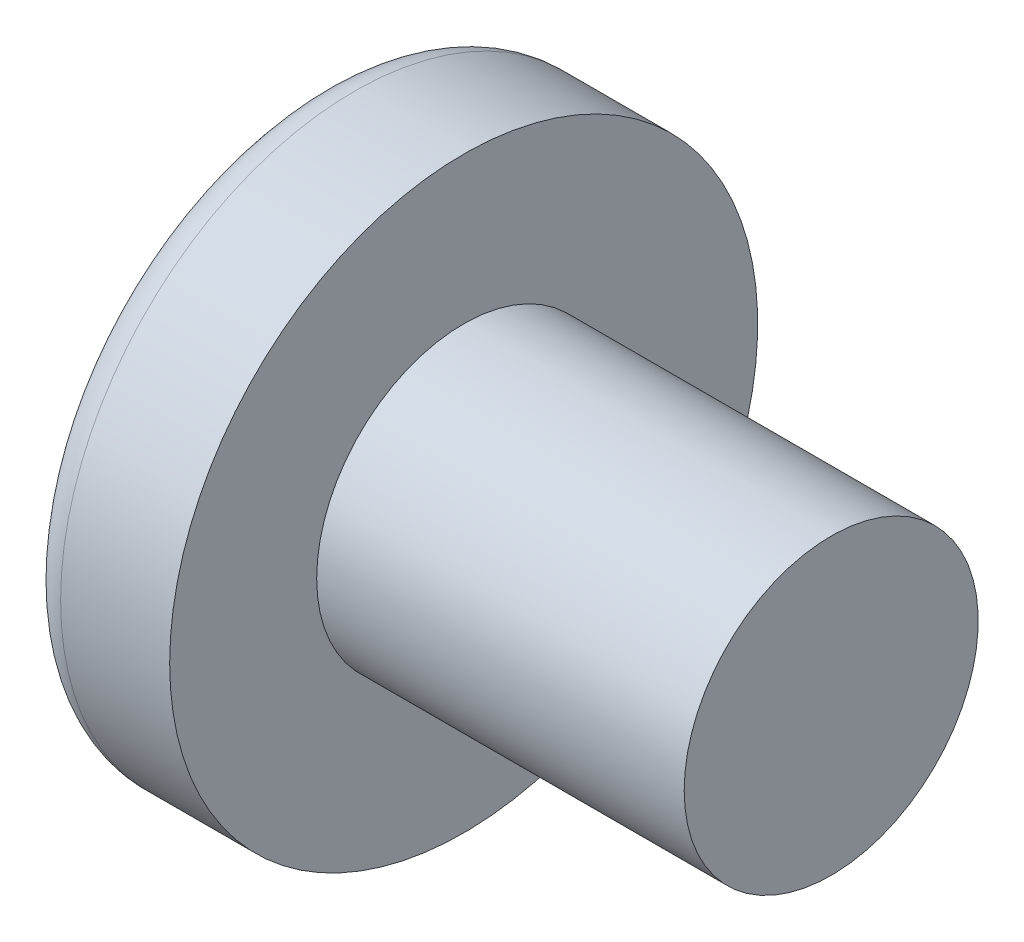
ISO-10303-21;
HEADER;
FILE_DESCRIPTION(('STEP AP214'),'2;1');
FILE_NAME('part.step','',(''),(''),'','','');
FILE_SCHEMA(('AUTOMOTIVE_DESIGN { 1 0 10303 214 1 1 1 1 }'));
ENDSEC;
DATA;
#1=APPLICATION_CONTEXT('core data for automotive mechanical design processes');
#2=APPLICATION_PROTOCOL_DEFINITION('international standard','automotive_design',2000,#1);
#3=PRODUCT_CONTEXT('',#1,'mechanical');
#4=PRODUCT('Part','Part','',(#3));
#5=PRODUCT_RELATED_PRODUCT_CATEGORY('part','',(#4));
#6=PRODUCT_DEFINITION_FORMATION('','',#4);
#7=PRODUCT_DEFINITION_CONTEXT('part definition',#1,'design');
#8=PRODUCT_DEFINITION('design','',#6,#7);
#9=PRODUCT_DEFINITION_SHAPE('','',#8);
#10=(LENGTH_UNIT() NAMED_UNIT(*) SI_UNIT(.MILLI.,.METRE.));
#11=(NAMED_UNIT(*) PLANE_ANGLE_UNIT() SI_UNIT($,.RADIAN.));
#12=(NAMED_UNIT(*) SI_UNIT($,.STERADIAN.) SOLID_ANGLE_UNIT());
#13=UNCERTAINTY_MEASURE_WITH_UNIT(LENGTH_MEASURE(1.E-05),#10,'distance_accuracy_value','');
#14=(GEOMETRIC_REPRESENTATION_CONTEXT(3) GLOBAL_UNCERTAINTY_ASSIGNED_CONTEXT((#13)) GLOBAL_UNIT_ASSIGNED_CONTEXT((#10,
#11,#12)) REPRESENTATION_CONTEXT('',''));
#15=CARTESIAN_POINT('',(0.,0.,0.));
#16=DIRECTION('',(0.,0.,1.));
#17=DIRECTION('',(1.,0.,0.));
#18=AXIS2_PLACEMENT_3D('',#15,#16,#17);
#19=CARTESIAN_POINT('',(6.5,0.,0.));
#20=DIRECTION('',(-1.,0.,0.));
#21=DIRECTION('',(0.,1.,0.));
#22=AXIS2_PLACEMENT_3D('',#19,#20,#21);
#23=SPHERICAL_SURFACE('',#22,6.5);
#24=CARTESIAN_POINT('',(1.22696010591455,0.,0.));
#25=DIRECTION('',(-1.,0.,0.));
#26=DIRECTION('',(0.,0.,1.));
#27=AXIS2_PLACEMENT_3D('',#24,#25,#26);
#28=CIRCLE('',#27,3.80066445182724);
#29=CARTESIAN_POINT('',(1.22696010591455,0.,3.80066445182724));
#30=VERTEX_POINT('',#29);
#31=EDGE_CURVE('E153',#30,#30,#28,.T.);
#32=ORIENTED_EDGE('',*,*,#31,.T.);
#33=EDGE_LOOP('',(#32));
#34=FACE_BOUND('',#33,.T.);
#35=CARTESIAN_POINT('',(6.48571960757402,-0.15048155459631,0.));
#36=DIRECTION('',(-0.0944735162161081,-0.995527375180494,0.));
#37=DIRECTION('',(0.995527375180494,-0.0944735162161081,0.));
#38=AXIS2_PLACEMENT_3D('',#35,#36,#37);
#39=CIRCLE('',#38,6.49824217555167);
#40=CARTESIAN_POINT('',(0.314004666074212,0.4352015980154,1.94783502836694));
#41=VERTEX_POINT('',#40);
#42=CARTESIAN_POINT('',(0.0329034112486444,0.461877533422321,0.461877533422323));
#43=VERTEX_POINT('',#42);
#44=EDGE_CURVE('E184',#41,#43,#39,.T.);
#45=ORIENTED_EDGE('',*,*,#44,.F.);
#46=CARTESIAN_POINT('',(5.02565375064329,0.,-1.83590765485334));
#47=DIRECTION('',(0.626149356629992,0.,0.779703137861998));
#48=DIRECTION('',(0.779703137861998,0.,-0.626149356629992));
#49=AXIS2_PLACEMENT_3D('',#46,#47,#48);
#50=CIRCLE('',#49,6.05852673674539);
#51=CARTESIAN_POINT('',(0.314004666074212,-0.435201598015413,1.94783502836693));
#52=VERTEX_POINT('',#51);
#53=EDGE_CURVE('E149',#41,#52,#50,.T.);
#54=ORIENTED_EDGE('',*,*,#53,.T.);
#55=CARTESIAN_POINT('',(6.48571960757402,0.15048155459631,0.));
#56=DIRECTION('',(-0.0944735162161081,0.995527375180494,0.));
#57=DIRECTION('',(-0.995527375180494,-0.0944735162161081,0.));
#58=AXIS2_PLACEMENT_3D('',#55,#56,#57);
#59=CIRCLE('',#58,6.49824217555167);
#60=CARTESIAN_POINT('',(0.0329034112486444,-0.461877533422324,0.461877533422322));
#61=VERTEX_POINT('',#60);
#62=EDGE_CURVE('E105',#61,#52,#59,.T.);
#63=ORIENTED_EDGE('',*,*,#62,.F.);
#64=CARTESIAN_POINT('',(6.48571960757402,0.,-0.15048155459631));
#65=DIRECTION('',(-0.0944735162161081,0.,-0.995527375180494));
#66=DIRECTION('',(-0.995527375180494,0.,0.0944735162161081));
#67=AXIS2_PLACEMENT_3D('',#64,#65,#66);
#68=CIRCLE('',#67,6.49824217555167);
#69=CARTESIAN_POINT('',(0.314004666074212,-1.94783502836693,0.435201598015406));
#70=VERTEX_POINT('',#69);
#71=EDGE_CURVE('E130',#70,#61,#68,.T.);
#72=ORIENTED_EDGE('',*,*,#71,.F.);
#73=CARTESIAN_POINT('',(5.02565375064329,1.83590765485334,0.));
#74=DIRECTION('',(0.626149356629992,-0.779703137861998,0.));
#75=DIRECTION('',(0.779703137861998,0.626149356629992,0.));
#76=AXIS2_PLACEMENT_3D('',#73,#74,#75);
#77=CIRCLE('',#76,6.05852673674539);
#78=CARTESIAN_POINT('',(0.314004666074212,-1.94783502836693,-0.435201598015406));
#79=VERTEX_POINT('',#78);
#80=EDGE_CURVE('E138',#70,#79,#77,.T.);
#81=ORIENTED_EDGE('',*,*,#80,.T.);
#82=CARTESIAN_POINT('',(6.48571960757402,0.,0.15048155459631));
#83=DIRECTION('',(-0.0944735162161081,0.,0.995527375180494));
#84=DIRECTION('',(0.995527375180494,0.,0.0944735162161081));
#85=AXIS2_PLACEMENT_3D('',#82,#83,#84);
#86=CIRCLE('',#85,6.49824217555167);
#87=CARTESIAN_POINT('',(0.0329034112486444,-0.461877533422321,-0.461877533422323));
#88=VERTEX_POINT('',#87);
#89=EDGE_CURVE('E48',#88,#79,#86,.T.);
#90=ORIENTED_EDGE('',*,*,#89,.F.);
#91=CARTESIAN_POINT('',(0.314004666074212,-0.435201598015399,-1.94783502836693));
#92=VERTEX_POINT('',#91);
#93=EDGE_CURVE('E191',#92,#88,#59,.T.);
#94=ORIENTED_EDGE('',*,*,#93,.F.);
#95=CARTESIAN_POINT('',(5.02565375064329,0.,1.83590765485334));
#96=DIRECTION('',(0.626149356629992,0.,-0.779703137861998));
#97=DIRECTION('',(-0.779703137861998,0.,-0.626149356629992));
#98=AXIS2_PLACEMENT_3D('',#95,#96,#97);
#99=CIRCLE('',#98,6.05852673674539);
#100=CARTESIAN_POINT('',(0.314004666074212,0.435201598015413,-1.94783502836693));
#101=VERTEX_POINT('',#100);
#102=EDGE_CURVE('E131',#92,#101,#99,.T.);
#103=ORIENTED_EDGE('',*,*,#102,.T.);
#104=CARTESIAN_POINT('',(0.0329034112486444,0.461877533422324,-0.461877533422323));
#105=VERTEX_POINT('',#104);
#106=EDGE_CURVE('E179',#105,#101,#39,.T.);
#107=ORIENTED_EDGE('',*,*,#106,.F.);
#108=CARTESIAN_POINT('',(0.314004666074212,1.94783502836693,-0.435201598015406));
#109=VERTEX_POINT('',#108);
#110=EDGE_CURVE('E41',#109,#105,#86,.T.);
#111=ORIENTED_EDGE('',*,*,#110,.F.);
#112=CARTESIAN_POINT('',(5.02565375064329,-1.83590765485334,0.));
#113=DIRECTION('',(0.626149356629992,0.779703137861998,0.));
#114=DIRECTION('',(-0.779703137861998,0.626149356629992,0.));
#115=AXIS2_PLACEMENT_3D('',#112,#113,#114);
#116=CIRCLE('',#115,6.05852673674539);
#117=CARTESIAN_POINT('',(0.314004666074212,1.94783502836693,0.435201598015407));
#118=VERTEX_POINT('',#117);
#119=EDGE_CURVE('E11',#109,#118,#116,.T.);
#120=ORIENTED_EDGE('',*,*,#119,.T.);
#121=EDGE_CURVE('E167',#43,#118,#68,.T.);
#122=ORIENTED_EDGE('',*,*,#121,.F.);
#123=EDGE_LOOP('',(#45,#54,#63,#72,#81,#90,#94,#103,#107,#111,#120,#122));
#124=FACE_BOUND('',#123,.T.);
#125=ADVANCED_FACE('F33',(#34,#124),#23,.T.);
#126=CARTESIAN_POINT('',(2.73951715374841,0.,-0.20502541296061));
#127=DIRECTION('',(-0.0944735162161081,0.,0.995527375180494));
#128=DIRECTION('',(0.995527375180494,0.,0.0944735162161081));
#129=AXIS2_PLACEMENT_3D('',#126,#127,#128);
#130=PLANE('',#129);
#131=ORIENTED_EDGE('',*,*,#110,.T.);
#132=DIRECTION('',(0.991114231601325,-0.0940547178968607,0.0940547178968604));
#133=VECTOR('',#132,1.);
#134=CARTESIAN_POINT('',(2.75862941145706,0.203211698708667,-0.203211698708667));
#135=LINE('',#134,#133);
#136=CARTESIAN_POINT('',(2.45,0.232500000000001,-0.232499999999999));
#137=VERTEX_POINT('',#136);
#138=EDGE_CURVE('E173',#105,#137,#135,.T.);
#139=ORIENTED_EDGE('',*,*,#138,.T.);
#140=DIRECTION('',(0.777577482844895,-0.624442325509115,0.0737905162291584));
#141=VECTOR('',#140,1.);
#142=CARTESIAN_POINT('',(0.,2.2,-0.465));
#143=LINE('',#142,#141);
#144=EDGE_CURVE('E154',#109,#137,#143,.T.);
#145=ORIENTED_EDGE('',*,*,#144,.F.);
#146=EDGE_LOOP('',(#131,#139,#145));
#147=FACE_BOUND('',#146,.T.);
#148=ADVANCED_FACE('F172',(#147),#130,.T.);
#149=DIRECTION('',(0.777577482844895,0.624442325509115,0.0737905162291584));
#150=VECTOR('',#149,1.);
#151=CARTESIAN_POINT('',(0.,-2.2,-0.465));
#152=LINE('',#151,#150);
#153=CARTESIAN_POINT('',(2.45,-0.2325,-0.2325));
#154=VERTEX_POINT('',#153);
#155=EDGE_CURVE('E139',#79,#154,#152,.T.);
#156=ORIENTED_EDGE('',*,*,#155,.T.);
#157=DIRECTION('',(-0.991114231601325,-0.09405471789686,-0.0940547178968604));
#158=VECTOR('',#157,1.);
#159=CARTESIAN_POINT('',(2.75862941145706,-0.203211698708666,-0.203211698708667));
#160=LINE('',#159,#158);
#161=EDGE_CURVE('E194',#154,#88,#160,.T.);
#162=ORIENTED_EDGE('',*,*,#161,.T.);
#163=ORIENTED_EDGE('',*,*,#89,.T.);
#164=EDGE_LOOP('',(#156,#162,#163));
#165=FACE_BOUND('',#164,.T.);
#166=ADVANCED_FACE('F209',(#165),#130,.T.);
#167=CARTESIAN_POINT('',(2.73951715374841,0.,0.20502541296061));
#168=DIRECTION('',(-0.0944735162161081,0.,-0.995527375180494));
#169=DIRECTION('',(-0.995527375180494,0.,0.0944735162161081));
#170=AXIS2_PLACEMENT_3D('',#167,#168,#169);
#171=PLANE('',#170);
#172=DIRECTION('',(0.777577482844895,-0.624442325509115,-0.0737905162291584));
#173=VECTOR('',#172,1.);
#174=CARTESIAN_POINT('',(0.,2.2,0.465));
#175=LINE('',#174,#173);
#176=CARTESIAN_POINT('',(2.45,0.2325,0.2325));
#177=VERTEX_POINT('',#176);
#178=EDGE_CURVE('E210',#118,#177,#175,.T.);
#179=ORIENTED_EDGE('',*,*,#178,.T.);
#180=DIRECTION('',(-0.991114231601325,0.0940547178968601,0.0940547178968603));
#181=VECTOR('',#180,1.);
#182=CARTESIAN_POINT('',(2.75862941145706,0.203211698708666,0.203211698708667));
#183=LINE('',#182,#181);
#184=EDGE_CURVE('E188',#177,#43,#183,.T.);
#185=ORIENTED_EDGE('',*,*,#184,.T.);
#186=ORIENTED_EDGE('',*,*,#121,.T.);
#187=EDGE_LOOP('',(#179,#185,#186));
#188=FACE_BOUND('',#187,.T.);
#189=ADVANCED_FACE('F214',(#188),#171,.T.);
#190=ORIENTED_EDGE('',*,*,#71,.T.);
#191=DIRECTION('',(0.991114231601325,0.0940547178968607,-0.0940547178968603));
#192=VECTOR('',#191,1.);
#193=CARTESIAN_POINT('',(2.75862941145706,-0.203211698708668,0.203211698708667));
#194=LINE('',#193,#192);
#195=CARTESIAN_POINT('',(2.45,-0.232500000000001,0.232499999999999));
#196=VERTEX_POINT('',#195);
#197=EDGE_CURVE('E103',#61,#196,#194,.T.);
#198=ORIENTED_EDGE('',*,*,#197,.T.);
#199=DIRECTION('',(0.777577482844895,0.624442325509115,-0.0737905162291583));
#200=VECTOR('',#199,1.);
#201=CARTESIAN_POINT('',(0.,-2.2,0.465));
#202=LINE('',#201,#200);
#203=EDGE_CURVE('E128',#70,#196,#202,.T.);
#204=ORIENTED_EDGE('',*,*,#203,.F.);
#205=EDGE_LOOP('',(#190,#198,#204));
#206=FACE_BOUND('',#205,.T.);
#207=ADVANCED_FACE('F127',(#206),#171,.T.);
#208=CARTESIAN_POINT('',(-25.4,0.,0.));
#209=DIRECTION('',(-1.,0.,0.));
#210=DIRECTION('',(0.,0.,1.));
#211=AXIS2_PLACEMENT_3D('',#208,#209,#210);
#212=CYLINDRICAL_SURFACE('',#211,2.);
#213=CARTESIAN_POINT('',(8.1,0.,0.));
#214=DIRECTION('',(-1.,0.,0.));
#215=DIRECTION('',(0.,0.,1.));
#216=AXIS2_PLACEMENT_3D('',#213,#214,#215);
#217=CIRCLE('',#216,2.);
#218=CARTESIAN_POINT('',(8.1,0.,2.));
#219=VERTEX_POINT('',#218);
#220=EDGE_CURVE('E150',#219,#219,#217,.T.);
#221=ORIENTED_EDGE('',*,*,#220,.T.);
#222=EDGE_LOOP('',(#221));
#223=FACE_BOUND('',#222,.T.);
#224=CARTESIAN_POINT('',(3.1,0.,0.));
#225=DIRECTION('',(-1.,0.,0.));
#226=DIRECTION('',(0.,0.,1.));
#227=AXIS2_PLACEMENT_3D('',#224,#225,#226);
#228=CIRCLE('',#227,2.);
#229=CARTESIAN_POINT('',(3.1,0.,2.));
#230=VERTEX_POINT('',#229);
#231=EDGE_CURVE('E163',#230,#230,#228,.T.);
#232=ORIENTED_EDGE('',*,*,#231,.F.);
#233=EDGE_LOOP('',(#232));
#234=FACE_BOUND('',#233,.T.);
#235=ADVANCED_FACE('F35',(#223,#234),#212,.T.);
#236=CARTESIAN_POINT('',(3.1,2.,0.));
#237=DIRECTION('',(-1.,0.,0.));
#238=DIRECTION('',(0.,0.,1.));
#239=AXIS2_PLACEMENT_3D('',#236,#237,#238);
#240=PLANE('',#239);
#241=CARTESIAN_POINT('',(3.1,0.,0.));
#242=DIRECTION('',(-1.,0.,0.));
#243=DIRECTION('',(0.,0.,1.));
#244=AXIS2_PLACEMENT_3D('',#241,#242,#243);
#245=CIRCLE('',#244,4.);
#246=CARTESIAN_POINT('',(3.1,0.,4.));
#247=VERTEX_POINT('',#246);
#248=EDGE_CURVE('E160',#247,#247,#245,.T.);
#249=ORIENTED_EDGE('',*,*,#248,.F.);
#250=EDGE_LOOP('',(#249));
#251=FACE_BOUND('',#250,.T.);
#252=ORIENTED_EDGE('',*,*,#231,.T.);
#253=EDGE_LOOP('',(#252));
#254=FACE_BOUND('',#253,.T.);
#255=ADVANCED_FACE('F242',(#251,#254),#240,.F.);
#256=CARTESIAN_POINT('',(-25.4,0.,0.));
#257=DIRECTION('',(-1.,0.,0.));
#258=DIRECTION('',(0.,0.,1.));
#259=AXIS2_PLACEMENT_3D('',#256,#257,#258);
#260=CYLINDRICAL_SURFACE('',#259,4.);
#261=ORIENTED_EDGE('',*,*,#248,.T.);
#262=EDGE_LOOP('',(#261));
#263=FACE_BOUND('',#262,.T.);
#264=CARTESIAN_POINT('',(1.61635382117009,0.,0.));
#265=DIRECTION('',(-1.,0.,0.));
#266=DIRECTION('',(0.,0.,1.));
#267=AXIS2_PLACEMENT_3D('',#264,#265,#266);
#268=CIRCLE('',#267,4.);
#269=CARTESIAN_POINT('',(1.61635382117009,0.,4.));
#270=VERTEX_POINT('',#269);
#271=EDGE_CURVE('E157',#270,#270,#268,.T.);
#272=ORIENTED_EDGE('',*,*,#271,.F.);
#273=EDGE_LOOP('',(#272));
#274=FACE_BOUND('',#273,.T.);
#275=ADVANCED_FACE('F239',(#263,#274),#260,.T.);
#276=CARTESIAN_POINT('',(1.61635382117009,0.,0.));
#277=DIRECTION('',(-1.,0.,0.));
#278=DIRECTION('',(0.,0.,1.));
#279=AXIS2_PLACEMENT_3D('',#276,#277,#278);
#280=TOROIDAL_SURFACE('',#279,3.52,0.48);
#281=ORIENTED_EDGE('',*,*,#271,.T.);
#282=EDGE_LOOP('',(#281));
#283=FACE_BOUND('',#282,.T.);
#284=ORIENTED_EDGE('',*,*,#31,.F.);
#285=EDGE_LOOP('',(#284));
#286=FACE_BOUND('',#285,.T.);
#287=ADVANCED_FACE('F236',(#283,#286),#280,.T.);
#288=CARTESIAN_POINT('',(8.1,2.,0.));
#289=DIRECTION('',(1.,0.,0.));
#290=DIRECTION('',(0.,0.,-1.));
#291=AXIS2_PLACEMENT_3D('',#288,#289,#290);
#292=PLANE('',#291);
#293=ORIENTED_EDGE('',*,*,#220,.F.);
#294=EDGE_LOOP('',(#293));
#295=FACE_BOUND('',#294,.T.);
#296=ADVANCED_FACE('F234',(#295),#292,.T.);
#297=CARTESIAN_POINT('',(2.45,0.2325,0.2325));
#298=DIRECTION('',(0.626149356629992,0.779703137861998,0.));
#299=DIRECTION('',(-0.779703137861998,0.626149356629992,0.));
#300=AXIS2_PLACEMENT_3D('',#297,#298,#299);
#301=PLANE('',#300);
#302=ORIENTED_EDGE('',*,*,#144,.T.);
#303=DIRECTION('',(0.,0.,-1.));
#304=VECTOR('',#303,1.);
#305=CARTESIAN_POINT('',(2.45,0.2325,0.2325));
#306=LINE('',#305,#304);
#307=EDGE_CURVE('E121',#177,#137,#306,.T.);
#308=ORIENTED_EDGE('',*,*,#307,.F.);
#309=ORIENTED_EDGE('',*,*,#178,.F.);
#310=ORIENTED_EDGE('',*,*,#119,.F.);
#311=EDGE_LOOP('',(#302,#308,#309,#310));
#312=FACE_BOUND('',#311,.T.);
#313=ADVANCED_FACE('F213',(#312),#301,.F.);
#314=CARTESIAN_POINT('',(2.45,-0.2325,-0.2325));
#315=DIRECTION('',(0.626149356629992,-0.779703137861998,0.));
#316=DIRECTION('',(0.779703137861998,0.626149356629992,0.));
#317=AXIS2_PLACEMENT_3D('',#314,#315,#316);
#318=PLANE('',#317);
#319=ORIENTED_EDGE('',*,*,#203,.T.);
#320=DIRECTION('',(0.,0.,1.));
#321=VECTOR('',#320,1.);
#322=CARTESIAN_POINT('',(2.45,-0.2325,-0.2325));
#323=LINE('',#322,#321);
#324=EDGE_CURVE('E120',#154,#196,#323,.T.);
#325=ORIENTED_EDGE('',*,*,#324,.F.);
#326=ORIENTED_EDGE('',*,*,#155,.F.);
#327=ORIENTED_EDGE('',*,*,#80,.F.);
#328=EDGE_LOOP('',(#319,#325,#326,#327));
#329=FACE_BOUND('',#328,.T.);
#330=ADVANCED_FACE('F135',(#329),#318,.F.);
#331=CARTESIAN_POINT('',(2.45,0.2325,-0.2325));
#332=DIRECTION('',(-1.,0.,0.));
#333=DIRECTION('',(0.,0.,1.));
#334=AXIS2_PLACEMENT_3D('',#331,#332,#333);
#335=PLANE('',#334);
#336=DIRECTION('',(0.,1.,0.));
#337=VECTOR('',#336,1.);
#338=CARTESIAN_POINT('',(2.45,-0.2325,-0.2325));
#339=LINE('',#338,#337);
#340=EDGE_CURVE('E143',#154,#137,#339,.T.);
#341=ORIENTED_EDGE('',*,*,#340,.F.);
#342=ORIENTED_EDGE('',*,*,#324,.T.);
#343=DIRECTION('',(0.,-1.,0.));
#344=VECTOR('',#343,1.);
#345=CARTESIAN_POINT('',(2.45,0.2325,0.2325));
#346=LINE('',#345,#344);
#347=EDGE_CURVE('E112',#177,#196,#346,.T.);
#348=ORIENTED_EDGE('',*,*,#347,.F.);
#349=ORIENTED_EDGE('',*,*,#307,.T.);
#350=EDGE_LOOP('',(#341,#342,#348,#349));
#351=FACE_BOUND('',#350,.T.);
#352=ADVANCED_FACE('F141',(#351),#335,.T.);
#353=CARTESIAN_POINT('',(2.45,0.232500000000001,-0.232499999999999));
#354=DIRECTION('',(0.626149356629992,0.,-0.779703137861998));
#355=DIRECTION('',(0.779703137861998,0.,0.626149356629992));
#356=AXIS2_PLACEMENT_3D('',#353,#354,#355);
#357=PLANE('',#356);
#358=DIRECTION('',(0.777577482844895,0.0737905162291561,0.624442325509115));
#359=VECTOR('',#358,1.);
#360=CARTESIAN_POINT('',(0.,-0.464999999999992,-2.2));
#361=LINE('',#360,#359);
#362=EDGE_CURVE('E199',#92,#154,#361,.T.);
#363=ORIENTED_EDGE('',*,*,#362,.T.);
#364=ORIENTED_EDGE('',*,*,#340,.T.);
#365=DIRECTION('',(0.777577482844895,-0.0737905162291606,0.624442325509114));
#366=VECTOR('',#365,1.);
#367=CARTESIAN_POINT('',(0.,0.465000000000008,-2.2));
#368=LINE('',#367,#366);
#369=EDGE_CURVE('E109',#101,#137,#368,.T.);
#370=ORIENTED_EDGE('',*,*,#369,.F.);
#371=ORIENTED_EDGE('',*,*,#102,.F.);
#372=EDGE_LOOP('',(#363,#364,#370,#371));
#373=FACE_BOUND('',#372,.T.);
#374=ADVANCED_FACE('F204',(#373),#357,.F.);
#375=CARTESIAN_POINT('',(2.73951715374841,-0.20502541296061,0.));
#376=DIRECTION('',(-0.0944735162161081,0.995527375180494,0.));
#377=DIRECTION('',(-0.995527375180494,-0.0944735162161081,0.));
#378=AXIS2_PLACEMENT_3D('',#375,#376,#377);
#379=PLANE('',#378);
#380=ORIENTED_EDGE('',*,*,#93,.T.);
#381=ORIENTED_EDGE('',*,*,#161,.F.);
#382=ORIENTED_EDGE('',*,*,#362,.F.);
#383=EDGE_LOOP('',(#380,#381,#382));
#384=FACE_BOUND('',#383,.T.);
#385=ADVANCED_FACE('F208',(#384),#379,.T.);
#386=CARTESIAN_POINT('',(2.73951715374841,0.20502541296061,0.));
#387=DIRECTION('',(-0.0944735162161081,-0.995527375180494,0.));
#388=DIRECTION('',(0.995527375180494,-0.0944735162161081,0.));
#389=AXIS2_PLACEMENT_3D('',#386,#387,#388);
#390=PLANE('',#389);
#391=ORIENTED_EDGE('',*,*,#106,.T.);
#392=ORIENTED_EDGE('',*,*,#369,.T.);
#393=ORIENTED_EDGE('',*,*,#138,.F.);
#394=EDGE_LOOP('',(#391,#392,#393));
#395=FACE_BOUND('',#394,.T.);
#396=ADVANCED_FACE('F202',(#395),#390,.T.);
#397=CARTESIAN_POINT('',(2.45,-0.232500000000001,0.232499999999999));
#398=DIRECTION('',(0.626149356629992,0.,0.779703137861998));
#399=DIRECTION('',(-0.779703137861998,0.,0.626149356629992));
#400=AXIS2_PLACEMENT_3D('',#397,#398,#399);
#401=PLANE('',#400);
#402=DIRECTION('',(0.777577482844895,-0.0737905162291562,-0.624442325509115));
#403=VECTOR('',#402,1.);
#404=CARTESIAN_POINT('',(0.,0.464999999999992,2.2));
#405=LINE('',#404,#403);
#406=EDGE_CURVE('E108',#41,#177,#405,.T.);
#407=ORIENTED_EDGE('',*,*,#406,.T.);
#408=ORIENTED_EDGE('',*,*,#347,.T.);
#409=DIRECTION('',(0.777577482844895,0.0737905162291606,-0.624442325509114));
#410=VECTOR('',#409,1.);
#411=CARTESIAN_POINT('',(0.,-0.465000000000008,2.2));
#412=LINE('',#411,#410);
#413=EDGE_CURVE('E99',#52,#196,#412,.T.);
#414=ORIENTED_EDGE('',*,*,#413,.F.);
#415=ORIENTED_EDGE('',*,*,#53,.F.);
#416=EDGE_LOOP('',(#407,#408,#414,#415));
#417=FACE_BOUND('',#416,.T.);
#418=ADVANCED_FACE('F113',(#417),#401,.F.);
#419=ORIENTED_EDGE('',*,*,#44,.T.);
#420=ORIENTED_EDGE('',*,*,#184,.F.);
#421=ORIENTED_EDGE('',*,*,#406,.F.);
#422=EDGE_LOOP('',(#419,#420,#421));
#423=FACE_BOUND('',#422,.T.);
#424=ADVANCED_FACE('F215',(#423),#390,.T.);
#425=ORIENTED_EDGE('',*,*,#62,.T.);
#426=ORIENTED_EDGE('',*,*,#413,.T.);
#427=ORIENTED_EDGE('',*,*,#197,.F.);
#428=EDGE_LOOP('',(#425,#426,#427));
#429=FACE_BOUND('',#428,.T.);
#430=ADVANCED_FACE('F101',(#429),#379,.T.);
#431=CLOSED_SHELL('',(#125,#148,#166,#189,#207,#235,#255,#275,#287,#296,#313,#330,#352,#374,
#385,#396,#418,#424,#430));
#432=MANIFOLD_SOLID_BREP('B2',#431);
#433=ADVANCED_BREP_SHAPE_REPRESENTATION('',(#18,#432),#14);
#434=SHAPE_DEFINITION_REPRESENTATION(#9,#433);
ENDSEC;
END-ISO-10303-21;
